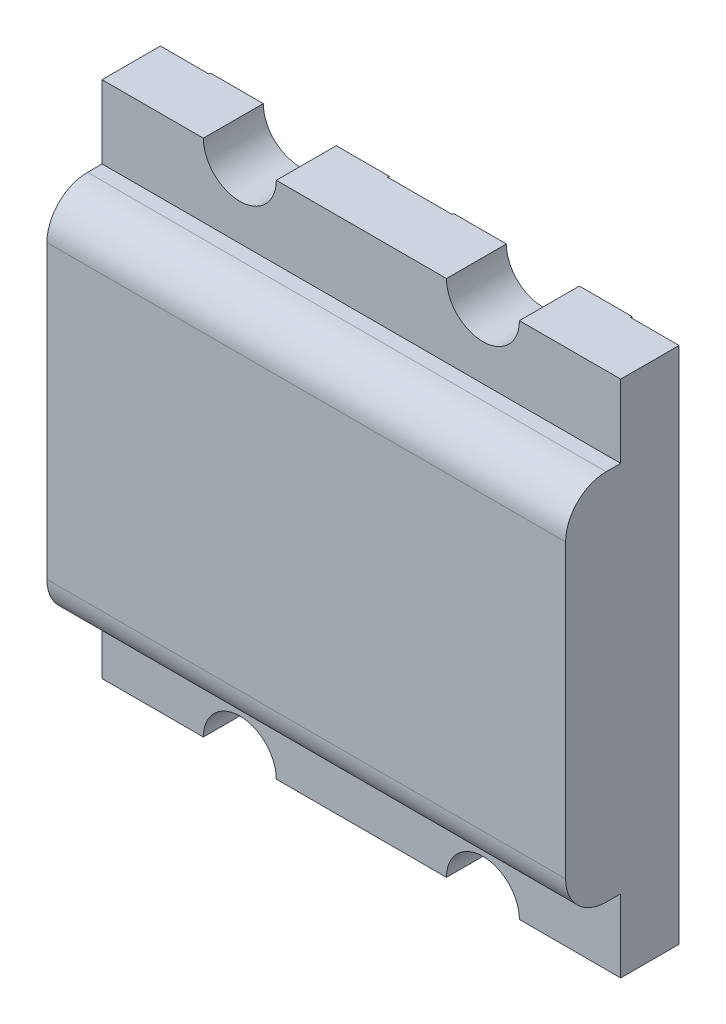
ISO-10303-21;
HEADER;
FILE_DESCRIPTION(('STEP AP214'),'2;1');
FILE_NAME('part.step','',(''),(''),'','','');
FILE_SCHEMA(('AUTOMOTIVE_DESIGN { 1 0 10303 214 1 1 1 1 }'));
ENDSEC;
DATA;
#1=APPLICATION_CONTEXT('core data for automotive mechanical design processes');
#2=APPLICATION_PROTOCOL_DEFINITION('international standard','automotive_design',2000,#1);
#3=PRODUCT_CONTEXT('',#1,'mechanical');
#4=PRODUCT('Part','Part','',(#3));
#5=PRODUCT_RELATED_PRODUCT_CATEGORY('part','',(#4));
#6=PRODUCT_DEFINITION_FORMATION('','',#4);
#7=PRODUCT_DEFINITION_CONTEXT('part definition',#1,'design');
#8=PRODUCT_DEFINITION('design','',#6,#7);
#9=PRODUCT_DEFINITION_SHAPE('','',#8);
#10=(LENGTH_UNIT() NAMED_UNIT(*) SI_UNIT(.MILLI.,.METRE.));
#11=(NAMED_UNIT(*) PLANE_ANGLE_UNIT() SI_UNIT($,.RADIAN.));
#12=(NAMED_UNIT(*) SI_UNIT($,.STERADIAN.) SOLID_ANGLE_UNIT());
#13=UNCERTAINTY_MEASURE_WITH_UNIT(LENGTH_MEASURE(1.E-05),#10,'distance_accuracy_value','');
#14=(GEOMETRIC_REPRESENTATION_CONTEXT(3) GLOBAL_UNCERTAINTY_ASSIGNED_CONTEXT((#13)) GLOBAL_UNIT_ASSIGNED_CONTEXT((#10,
#11,#12)) REPRESENTATION_CONTEXT('',''));
#15=CARTESIAN_POINT('',(0.,0.,0.));
#16=DIRECTION('',(0.,0.,1.));
#17=DIRECTION('',(1.,0.,0.));
#18=AXIS2_PLACEMENT_3D('',#15,#16,#17);
#19=CARTESIAN_POINT('',(-0.1,0.4,0.004895));
#20=DIRECTION('',(0.,-1.,0.));
#21=DIRECTION('',(-1.,0.,0.));
#22=AXIS2_PLACEMENT_3D('',#19,#20,#21);
#23=PLANE('',#22);
#24=DIRECTION('',(1.,0.,0.));
#25=VECTOR('',#24,1.);
#26=CARTESIAN_POINT('',(-0.05000000001,0.40000000001,0.00489500001));
#27=LINE('',#26,#25);
#28=CARTESIAN_POINT('',(-0.65,0.4,0.004895));
#29=VERTEX_POINT('',#28);
#30=CARTESIAN_POINT('',(-0.1,0.4,0.004895));
#31=VERTEX_POINT('',#30);
#32=EDGE_CURVE('E11',#29,#31,#27,.T.);
#33=ORIENTED_EDGE('',*,*,#32,.F.);
#34=DIRECTION('',(0.,0.,-1.));
#35=VECTOR('',#34,1.);
#36=CARTESIAN_POINT('',(-0.65000000001,0.40000000001,0.00489500001));
#37=LINE('',#36,#35);
#38=CARTESIAN_POINT('',(-0.65,0.4,0.));
#39=VERTEX_POINT('',#38);
#40=EDGE_CURVE('E25',#29,#39,#37,.T.);
#41=ORIENTED_EDGE('',*,*,#40,.T.);
#42=DIRECTION('',(-1.,0.,0.));
#43=VECTOR('',#42,1.);
#44=CARTESIAN_POINT('',(-0.10000000001,0.40000000001,0.));
#45=LINE('',#44,#43);
#46=CARTESIAN_POINT('',(-0.1,0.4,0.));
#47=VERTEX_POINT('',#46);
#48=EDGE_CURVE('E608',#47,#39,#45,.T.);
#49=ORIENTED_EDGE('',*,*,#48,.F.);
#50=DIRECTION('',(0.,0.,-1.));
#51=VECTOR('',#50,1.);
#52=CARTESIAN_POINT('',(-0.10000000001,0.40000000001,0.00489500001));
#53=LINE('',#52,#51);
#54=EDGE_CURVE('E604',#31,#47,#53,.T.);
#55=ORIENTED_EDGE('',*,*,#54,.F.);
#56=EDGE_LOOP('',(#33,#41,#49,#55));
#57=FACE_BOUND('',#56,.T.);
#58=ADVANCED_FACE('F17',(#57),#23,.T.);
#59=CARTESIAN_POINT('',(-0.1,0.8,0.004895));
#60=DIRECTION('',(1.,0.,0.));
#61=DIRECTION('',(0.,0.,1.));
#62=AXIS2_PLACEMENT_3D('',#59,#60,#61);
#63=PLANE('',#62);
#64=DIRECTION('',(0.,1.,0.));
#65=VECTOR('',#64,1.);
#66=CARTESIAN_POINT('',(-0.10000000001,0.40000000001,0.00489500001));
#67=LINE('',#66,#65);
#68=CARTESIAN_POINT('',(-0.1,0.8,0.004895));
#69=VERTEX_POINT('',#68);
#70=EDGE_CURVE('E601',#31,#69,#67,.T.);
#71=ORIENTED_EDGE('',*,*,#70,.F.);
#72=ORIENTED_EDGE('',*,*,#54,.T.);
#73=DIRECTION('',(0.,-1.,0.));
#74=VECTOR('',#73,1.);
#75=CARTESIAN_POINT('',(-0.10000000001,0.80000000001,0.));
#76=LINE('',#75,#74);
#77=CARTESIAN_POINT('',(-0.1,0.8,0.));
#78=VERTEX_POINT('',#77);
#79=EDGE_CURVE('E597',#78,#47,#76,.T.);
#80=ORIENTED_EDGE('',*,*,#79,.F.);
#81=DIRECTION('',(0.,0.,-1.));
#82=VECTOR('',#81,1.);
#83=CARTESIAN_POINT('',(-0.10000000001,0.80000000001,0.00489500001));
#84=LINE('',#83,#82);
#85=EDGE_CURVE('E593',#69,#78,#84,.T.);
#86=ORIENTED_EDGE('',*,*,#85,.F.);
#87=EDGE_LOOP('',(#71,#72,#80,#86));
#88=FACE_BOUND('',#87,.T.);
#89=ADVANCED_FACE('F635',(#88),#63,.T.);
#90=CARTESIAN_POINT('',(0.4,0.45,0.229895));
#91=DIRECTION('',(1.,0.,0.));
#92=DIRECTION('',(0.,0.707106781186548,0.707106781186548));
#93=AXIS2_PLACEMENT_3D('',#90,#91,#92);
#94=CYLINDRICAL_SURFACE('',#93,0.125);
#95=CARTESIAN_POINT('',(-0.80000000001,0.45000000001,0.22989500001));
#96=DIRECTION('',(1.,0.,0.));
#97=DIRECTION('',(0.,0.707106781186548,0.707106781186548));
#98=AXIS2_PLACEMENT_3D('',#95,#96,#97);
#99=CIRCLE('',#98,0.125);
#100=CARTESIAN_POINT('',(-0.8,0.575,0.229895));
#101=VERTEX_POINT('',#100);
#102=CARTESIAN_POINT('',(-0.8,0.45,0.354895));
#103=VERTEX_POINT('',#102);
#104=EDGE_CURVE('E590',#101,#103,#99,.T.);
#105=ORIENTED_EDGE('',*,*,#104,.T.);
#106=DIRECTION('',(1.,0.,0.));
#107=VECTOR('',#106,1.);
#108=CARTESIAN_POINT('',(0.40000000001,0.45000000001,0.35489500001));
#109=LINE('',#108,#107);
#110=CARTESIAN_POINT('',(0.8,0.45,0.354895));
#111=VERTEX_POINT('',#110);
#112=EDGE_CURVE('E587',#103,#111,#109,.T.);
#113=ORIENTED_EDGE('',*,*,#112,.T.);
#114=CARTESIAN_POINT('',(0.80000000001,0.45000000001,0.22989500001));
#115=DIRECTION('',(-1.,0.,0.));
#116=DIRECTION('',(0.,0.707106781186548,0.707106781186548));
#117=AXIS2_PLACEMENT_3D('',#114,#115,#116);
#118=CIRCLE('',#117,0.125);
#119=CARTESIAN_POINT('',(0.8,0.575,0.229895));
#120=VERTEX_POINT('',#119);
#121=EDGE_CURVE('E584',#111,#120,#118,.T.);
#122=ORIENTED_EDGE('',*,*,#121,.T.);
#123=DIRECTION('',(-1.,0.,0.));
#124=VECTOR('',#123,1.);
#125=CARTESIAN_POINT('',(0.40000000001,0.57500000001,0.22989500001));
#126=LINE('',#125,#124);
#127=EDGE_CURVE('E580',#120,#101,#126,.T.);
#128=ORIENTED_EDGE('',*,*,#127,.T.);
#129=EDGE_LOOP('',(#105,#113,#122,#128));
#130=FACE_BOUND('',#129,.T.);
#131=ADVANCED_FACE('F660',(#130),#94,.T.);
#132=CARTESIAN_POINT('',(0.,0.,0.354895));
#133=DIRECTION('',(0.,0.,1.));
#134=DIRECTION('',(1.,0.,0.));
#135=AXIS2_PLACEMENT_3D('',#132,#133,#134);
#136=PLANE('',#135);
#137=ORIENTED_EDGE('',*,*,#112,.F.);
#138=DIRECTION('',(0.,-1.,0.));
#139=VECTOR('',#138,1.);
#140=CARTESIAN_POINT('',(-0.80000000001,-0.57500000001,0.35489500001));
#141=LINE('',#140,#139);
#142=CARTESIAN_POINT('',(-0.8,-0.45,0.354895));
#143=VERTEX_POINT('',#142);
#144=EDGE_CURVE('E577',#103,#143,#141,.T.);
#145=ORIENTED_EDGE('',*,*,#144,.T.);
#146=DIRECTION('',(-1.,0.,0.));
#147=VECTOR('',#146,1.);
#148=CARTESIAN_POINT('',(-0.40000000001,-0.45000000001,0.35489500001));
#149=LINE('',#148,#147);
#150=CARTESIAN_POINT('',(0.8,-0.45,0.354895));
#151=VERTEX_POINT('',#150);
#152=EDGE_CURVE('E573',#151,#143,#149,.T.);
#153=ORIENTED_EDGE('',*,*,#152,.F.);
#154=DIRECTION('',(0.,1.,0.));
#155=VECTOR('',#154,1.);
#156=CARTESIAN_POINT('',(0.80000000001,0.57500000001,0.35489500001));
#157=LINE('',#156,#155);
#158=EDGE_CURVE('E569',#151,#111,#157,.T.);
#159=ORIENTED_EDGE('',*,*,#158,.T.);
#160=EDGE_LOOP('',(#137,#145,#153,#159));
#161=FACE_BOUND('',#160,.T.);
#162=ADVANCED_FACE('F664',(#161),#136,.T.);
#163=CARTESIAN_POINT('',(-0.8,0.8,0.004895));
#164=DIRECTION('',(-1.,0.,0.));
#165=DIRECTION('',(0.,1.,0.));
#166=AXIS2_PLACEMENT_3D('',#163,#164,#165);
#167=PLANE('',#166);
#168=ORIENTED_EDGE('',*,*,#104,.F.);
#169=DIRECTION('',(0.,0.,1.));
#170=VECTOR('',#169,1.);
#171=CARTESIAN_POINT('',(-0.80000000001,0.57500000001,0.18489500001));
#172=LINE('',#171,#170);
#173=CARTESIAN_POINT('',(-0.8,0.575,0.184895));
#174=VERTEX_POINT('',#173);
#175=EDGE_CURVE('E565',#174,#101,#172,.T.);
#176=ORIENTED_EDGE('',*,*,#175,.F.);
#177=DIRECTION('',(0.,-1.,0.));
#178=VECTOR('',#177,1.);
#179=CARTESIAN_POINT('',(-0.80000000001,-0.80000000001,0.18489500001));
#180=LINE('',#179,#178);
#181=CARTESIAN_POINT('',(-0.8,0.8,0.184895));
#182=VERTEX_POINT('',#181);
#183=EDGE_CURVE('E561',#182,#174,#180,.T.);
#184=ORIENTED_EDGE('',*,*,#183,.F.);
#185=DIRECTION('',(0.,0.,1.));
#186=VECTOR('',#185,1.);
#187=CARTESIAN_POINT('',(-0.80000000001,0.80000000001,0.00489500001));
#188=LINE('',#187,#186);
#189=CARTESIAN_POINT('',(-0.8,0.8,0.004895));
#190=VERTEX_POINT('',#189);
#191=EDGE_CURVE('E557',#190,#182,#188,.T.);
#192=ORIENTED_EDGE('',*,*,#191,.F.);
#193=DIRECTION('',(0.,1.,0.));
#194=VECTOR('',#193,1.);
#195=CARTESIAN_POINT('',(-0.80000000001,-0.80000000001,0.00489500001));
#196=LINE('',#195,#194);
#197=CARTESIAN_POINT('',(-0.8,-0.8,0.004895));
#198=VERTEX_POINT('',#197);
#199=EDGE_CURVE('E553',#198,#190,#196,.T.);
#200=ORIENTED_EDGE('',*,*,#199,.F.);
#201=DIRECTION('',(0.,0.,1.));
#202=VECTOR('',#201,1.);
#203=CARTESIAN_POINT('',(-0.80000000001,-0.80000000001,0.00489500001));
#204=LINE('',#203,#202);
#205=CARTESIAN_POINT('',(-0.8,-0.8,0.184895));
#206=VERTEX_POINT('',#205);
#207=EDGE_CURVE('E549',#198,#206,#204,.T.);
#208=ORIENTED_EDGE('',*,*,#207,.T.);
#209=DIRECTION('',(0.,-1.,0.));
#210=VECTOR('',#209,1.);
#211=CARTESIAN_POINT('',(-0.80000000001,-0.80000000001,0.18489500001));
#212=LINE('',#211,#210);
#213=CARTESIAN_POINT('',(-0.8,-0.575,0.184895));
#214=VERTEX_POINT('',#213);
#215=EDGE_CURVE('E545',#214,#206,#212,.T.);
#216=ORIENTED_EDGE('',*,*,#215,.F.);
#217=DIRECTION('',(0.,0.,1.));
#218=VECTOR('',#217,1.);
#219=CARTESIAN_POINT('',(-0.80000000001,-0.57500000001,0.18489500001));
#220=LINE('',#219,#218);
#221=CARTESIAN_POINT('',(-0.8,-0.575,0.229895));
#222=VERTEX_POINT('',#221);
#223=EDGE_CURVE('E542',#214,#222,#220,.T.);
#224=ORIENTED_EDGE('',*,*,#223,.T.);
#225=CARTESIAN_POINT('',(-0.80000000001,-0.45000000001,0.22989500001));
#226=DIRECTION('',(1.,0.,0.));
#227=DIRECTION('',(0.,-0.707106781186548,0.707106781186548));
#228=AXIS2_PLACEMENT_3D('',#225,#226,#227);
#229=CIRCLE('',#228,0.125);
#230=EDGE_CURVE('E538',#143,#222,#229,.T.);
#231=ORIENTED_EDGE('',*,*,#230,.F.);
#232=ORIENTED_EDGE('',*,*,#144,.F.);
#233=EDGE_LOOP('',(#168,#176,#184,#192,#200,#208,#216,#224,#231,#232));
#234=FACE_BOUND('',#233,.T.);
#235=ADVANCED_FACE('F671',(#234),#167,.T.);
#236=CARTESIAN_POINT('',(-0.4,-0.45,0.229895));
#237=DIRECTION('',(-1.,0.,0.));
#238=DIRECTION('',(0.,-0.707106781186548,0.707106781186548));
#239=AXIS2_PLACEMENT_3D('',#236,#237,#238);
#240=CYLINDRICAL_SURFACE('',#239,0.125);
#241=CARTESIAN_POINT('',(0.80000000001,-0.45000000001,0.22989500001));
#242=DIRECTION('',(-1.,0.,0.));
#243=DIRECTION('',(0.,-0.707106781186548,0.707106781186548));
#244=AXIS2_PLACEMENT_3D('',#241,#242,#243);
#245=CIRCLE('',#244,0.125);
#246=CARTESIAN_POINT('',(0.8,-0.575,0.229895));
#247=VERTEX_POINT('',#246);
#248=EDGE_CURVE('E534',#247,#151,#245,.T.);
#249=ORIENTED_EDGE('',*,*,#248,.T.);
#250=ORIENTED_EDGE('',*,*,#152,.T.);
#251=ORIENTED_EDGE('',*,*,#230,.T.);
#252=DIRECTION('',(1.,0.,0.));
#253=VECTOR('',#252,1.);
#254=CARTESIAN_POINT('',(-0.40000000001,-0.57500000001,0.22989500001));
#255=LINE('',#254,#253);
#256=EDGE_CURVE('E530',#222,#247,#255,.T.);
#257=ORIENTED_EDGE('',*,*,#256,.T.);
#258=EDGE_LOOP('',(#249,#250,#251,#257));
#259=FACE_BOUND('',#258,.T.);
#260=ADVANCED_FACE('F668',(#259),#240,.T.);
#261=CARTESIAN_POINT('',(-0.375,-0.8,0.));
#262=DIRECTION('',(0.,0.,-1.));
#263=DIRECTION('',(1.,0.,0.));
#264=AXIS2_PLACEMENT_3D('',#261,#262,#263);
#265=CYLINDRICAL_SURFACE('',#264,0.1125);
#266=DIRECTION('',(0.,0.,-1.));
#267=VECTOR('',#266,1.);
#268=CARTESIAN_POINT('',(-0.26250000001,-0.80000000001,0.));
#269=LINE('',#268,#267);
#270=CARTESIAN_POINT('',(-0.2625,-0.8,0.184895));
#271=VERTEX_POINT('',#270);
#272=CARTESIAN_POINT('',(-0.2625,-0.8,0.));
#273=VERTEX_POINT('',#272);
#274=EDGE_CURVE('E526',#271,#273,#269,.T.);
#275=ORIENTED_EDGE('',*,*,#274,.F.);
#276=CARTESIAN_POINT('',(-0.37500000001,-0.80000000001,0.18489500001));
#277=DIRECTION('',(0.,0.,-1.));
#278=DIRECTION('',(1.,0.,0.));
#279=AXIS2_PLACEMENT_3D('',#276,#277,#278);
#280=CIRCLE('',#279,0.1125);
#281=CARTESIAN_POINT('',(-0.4875,-0.8,0.184895));
#282=VERTEX_POINT('',#281);
#283=EDGE_CURVE('E523',#282,#271,#280,.T.);
#284=ORIENTED_EDGE('',*,*,#283,.F.);
#285=DIRECTION('',(0.,0.,1.));
#286=VECTOR('',#285,1.);
#287=CARTESIAN_POINT('',(-0.48750000001,-0.80000000001,0.));
#288=LINE('',#287,#286);
#289=CARTESIAN_POINT('',(-0.4875,-0.8,0.));
#290=VERTEX_POINT('',#289);
#291=EDGE_CURVE('E520',#290,#282,#288,.T.);
#292=ORIENTED_EDGE('',*,*,#291,.F.);
#293=CARTESIAN_POINT('',(-0.37500000001,-0.80000000001,0.));
#294=DIRECTION('',(0.,0.,1.));
#295=DIRECTION('',(1.,0.,0.));
#296=AXIS2_PLACEMENT_3D('',#293,#294,#295);
#297=CIRCLE('',#296,0.1125);
#298=EDGE_CURVE('E516',#273,#290,#297,.T.);
#299=ORIENTED_EDGE('',*,*,#298,.F.);
#300=EDGE_LOOP('',(#275,#284,#292,#299));
#301=FACE_BOUND('',#300,.T.);
#302=ADVANCED_FACE('F722',(#301),#265,.F.);
#303=CARTESIAN_POINT('',(-0.375,0.8,0.));
#304=DIRECTION('',(0.,0.,-1.));
#305=DIRECTION('',(1.,0.,0.));
#306=AXIS2_PLACEMENT_3D('',#303,#304,#305);
#307=CYLINDRICAL_SURFACE('',#306,0.1125);
#308=DIRECTION('',(0.,0.,1.));
#309=VECTOR('',#308,1.);
#310=CARTESIAN_POINT('',(-0.26250000001,0.80000000001,0.));
#311=LINE('',#310,#309);
#312=CARTESIAN_POINT('',(-0.2625,0.8,0.));
#313=VERTEX_POINT('',#312);
#314=CARTESIAN_POINT('',(-0.2625,0.8,0.184895));
#315=VERTEX_POINT('',#314);
#316=EDGE_CURVE('E513',#313,#315,#311,.T.);
#317=ORIENTED_EDGE('',*,*,#316,.F.);
#318=CARTESIAN_POINT('',(-0.37500000001,0.80000000001,0.));
#319=DIRECTION('',(0.,0.,1.));
#320=DIRECTION('',(1.,0.,0.));
#321=AXIS2_PLACEMENT_3D('',#318,#319,#320);
#322=CIRCLE('',#321,0.1125);
#323=CARTESIAN_POINT('',(-0.4875,0.8,0.));
#324=VERTEX_POINT('',#323);
#325=EDGE_CURVE('E509',#324,#313,#322,.T.);
#326=ORIENTED_EDGE('',*,*,#325,.F.);
#327=DIRECTION('',(0.,0.,-1.));
#328=VECTOR('',#327,1.);
#329=CARTESIAN_POINT('',(-0.48750000001,0.80000000001,0.));
#330=LINE('',#329,#328);
#331=CARTESIAN_POINT('',(-0.4875,0.8,0.184895));
#332=VERTEX_POINT('',#331);
#333=EDGE_CURVE('E506',#332,#324,#330,.T.);
#334=ORIENTED_EDGE('',*,*,#333,.F.);
#335=CARTESIAN_POINT('',(-0.37500000001,0.80000000001,0.18489500001));
#336=DIRECTION('',(0.,0.,-1.));
#337=DIRECTION('',(1.,0.,0.));
#338=AXIS2_PLACEMENT_3D('',#335,#336,#337);
#339=CIRCLE('',#338,0.1125);
#340=EDGE_CURVE('E503',#315,#332,#339,.T.);
#341=ORIENTED_EDGE('',*,*,#340,.F.);
#342=EDGE_LOOP('',(#317,#326,#334,#341));
#343=FACE_BOUND('',#342,.T.);
#344=ADVANCED_FACE('F720',(#343),#307,.F.);
#345=CARTESIAN_POINT('',(0.375,0.8,0.));
#346=DIRECTION('',(0.,0.,-1.));
#347=DIRECTION('',(1.,0.,0.));
#348=AXIS2_PLACEMENT_3D('',#345,#346,#347);
#349=CYLINDRICAL_SURFACE('',#348,0.1125);
#350=DIRECTION('',(0.,0.,1.));
#351=VECTOR('',#350,1.);
#352=CARTESIAN_POINT('',(0.48750000001,0.80000000001,0.));
#353=LINE('',#352,#351);
#354=CARTESIAN_POINT('',(0.4875,0.8,0.));
#355=VERTEX_POINT('',#354);
#356=CARTESIAN_POINT('',(0.4875,0.8,0.184895));
#357=VERTEX_POINT('',#356);
#358=EDGE_CURVE('E499',#355,#357,#353,.T.);
#359=ORIENTED_EDGE('',*,*,#358,.F.);
#360=CARTESIAN_POINT('',(0.37500000001,0.80000000001,0.));
#361=DIRECTION('',(0.,0.,1.));
#362=DIRECTION('',(1.,0.,0.));
#363=AXIS2_PLACEMENT_3D('',#360,#361,#362);
#364=CIRCLE('',#363,0.1125);
#365=CARTESIAN_POINT('',(0.2625,0.8,0.));
#366=VERTEX_POINT('',#365);
#367=EDGE_CURVE('E496',#366,#355,#364,.T.);
#368=ORIENTED_EDGE('',*,*,#367,.F.);
#369=DIRECTION('',(0.,0.,-1.));
#370=VECTOR('',#369,1.);
#371=CARTESIAN_POINT('',(0.26250000001,0.80000000001,0.));
#372=LINE('',#371,#370);
#373=CARTESIAN_POINT('',(0.2625,0.8,0.184895));
#374=VERTEX_POINT('',#373);
#375=EDGE_CURVE('E492',#374,#366,#372,.T.);
#376=ORIENTED_EDGE('',*,*,#375,.F.);
#377=CARTESIAN_POINT('',(0.37500000001,0.80000000001,0.18489500001));
#378=DIRECTION('',(0.,0.,-1.));
#379=DIRECTION('',(1.,0.,0.));
#380=AXIS2_PLACEMENT_3D('',#377,#378,#379);
#381=CIRCLE('',#380,0.1125);
#382=EDGE_CURVE('E489',#357,#374,#381,.T.);
#383=ORIENTED_EDGE('',*,*,#382,.F.);
#384=EDGE_LOOP('',(#359,#368,#376,#383));
#385=FACE_BOUND('',#384,.T.);
#386=ADVANCED_FACE('F643',(#385),#349,.F.);
#387=CARTESIAN_POINT('',(0.375,-0.8,0.));
#388=DIRECTION('',(0.,0.,-1.));
#389=DIRECTION('',(1.,0.,0.));
#390=AXIS2_PLACEMENT_3D('',#387,#388,#389);
#391=CYLINDRICAL_SURFACE('',#390,0.1125);
#392=DIRECTION('',(0.,0.,-1.));
#393=VECTOR('',#392,1.);
#394=CARTESIAN_POINT('',(0.48750000001,-0.80000000001,0.));
#395=LINE('',#394,#393);
#396=CARTESIAN_POINT('',(0.4875,-0.8,0.184895));
#397=VERTEX_POINT('',#396);
#398=CARTESIAN_POINT('',(0.4875,-0.8,0.));
#399=VERTEX_POINT('',#398);
#400=EDGE_CURVE('E486',#397,#399,#395,.T.);
#401=ORIENTED_EDGE('',*,*,#400,.F.);
#402=CARTESIAN_POINT('',(0.37500000001,-0.80000000001,0.18489500001));
#403=DIRECTION('',(0.,0.,-1.));
#404=DIRECTION('',(1.,0.,0.));
#405=AXIS2_PLACEMENT_3D('',#402,#403,#404);
#406=CIRCLE('',#405,0.1125);
#407=CARTESIAN_POINT('',(0.2625,-0.8,0.184895));
#408=VERTEX_POINT('',#407);
#409=EDGE_CURVE('E483',#408,#397,#406,.T.);
#410=ORIENTED_EDGE('',*,*,#409,.F.);
#411=DIRECTION('',(0.,0.,1.));
#412=VECTOR('',#411,1.);
#413=CARTESIAN_POINT('',(0.26250000001,-0.80000000001,0.));
#414=LINE('',#413,#412);
#415=CARTESIAN_POINT('',(0.2625,-0.8,0.));
#416=VERTEX_POINT('',#415);
#417=EDGE_CURVE('E479',#416,#408,#414,.T.);
#418=ORIENTED_EDGE('',*,*,#417,.F.);
#419=CARTESIAN_POINT('',(0.37500000001,-0.80000000001,0.));
#420=DIRECTION('',(0.,0.,1.));
#421=DIRECTION('',(1.,0.,0.));
#422=AXIS2_PLACEMENT_3D('',#419,#420,#421);
#423=CIRCLE('',#422,0.1125);
#424=EDGE_CURVE('E475',#399,#416,#423,.T.);
#425=ORIENTED_EDGE('',*,*,#424,.F.);
#426=EDGE_LOOP('',(#401,#410,#418,#425));
#427=FACE_BOUND('',#426,.T.);
#428=ADVANCED_FACE('F729',(#427),#391,.F.);
#429=CARTESIAN_POINT('',(-0.375,-0.6,0.));
#430=DIRECTION('',(0.,0.,-1.));
#431=DIRECTION('',(0.,-1.,0.));
#432=AXIS2_PLACEMENT_3D('',#429,#430,#431);
#433=PLANE('',#432);
#434=ORIENTED_EDGE('',*,*,#298,.T.);
#435=DIRECTION('',(-1.,0.,0.));
#436=VECTOR('',#435,1.);
#437=CARTESIAN_POINT('',(-0.10000000001,-0.80000000001,0.));
#438=LINE('',#437,#436);
#439=CARTESIAN_POINT('',(-0.65,-0.8,0.));
#440=VERTEX_POINT('',#439);
#441=EDGE_CURVE('E472',#290,#440,#438,.T.);
#442=ORIENTED_EDGE('',*,*,#441,.T.);
#443=DIRECTION('',(0.,1.,0.));
#444=VECTOR('',#443,1.);
#445=CARTESIAN_POINT('',(-0.65000000001,-0.80000000001,0.));
#446=LINE('',#445,#444);
#447=CARTESIAN_POINT('',(-0.65,-0.4,0.));
#448=VERTEX_POINT('',#447);
#449=EDGE_CURVE('E469',#440,#448,#446,.T.);
#450=ORIENTED_EDGE('',*,*,#449,.T.);
#451=DIRECTION('',(1.,0.,0.));
#452=VECTOR('',#451,1.);
#453=CARTESIAN_POINT('',(-0.65000000001,-0.40000000001,0.));
#454=LINE('',#453,#452);
#455=CARTESIAN_POINT('',(-0.1,-0.4,0.));
#456=VERTEX_POINT('',#455);
#457=EDGE_CURVE('E466',#448,#456,#454,.T.);
#458=ORIENTED_EDGE('',*,*,#457,.T.);
#459=DIRECTION('',(0.,-1.,0.));
#460=VECTOR('',#459,1.);
#461=CARTESIAN_POINT('',(-0.10000000001,-0.40000000001,0.));
#462=LINE('',#461,#460);
#463=CARTESIAN_POINT('',(-0.1,-0.8,0.));
#464=VERTEX_POINT('',#463);
#465=EDGE_CURVE('E462',#456,#464,#462,.T.);
#466=ORIENTED_EDGE('',*,*,#465,.T.);
#467=DIRECTION('',(-1.,0.,0.));
#468=VECTOR('',#467,1.);
#469=CARTESIAN_POINT('',(-0.10000000001,-0.80000000001,0.));
#470=LINE('',#469,#468);
#471=EDGE_CURVE('E459',#464,#273,#470,.T.);
#472=ORIENTED_EDGE('',*,*,#471,.T.);
#473=EDGE_LOOP('',(#434,#442,#450,#458,#466,#472));
#474=FACE_BOUND('',#473,.T.);
#475=ADVANCED_FACE('F781',(#474),#433,.T.);
#476=CARTESIAN_POINT('',(0.,0.,0.184895));
#477=DIRECTION('',(0.,0.,1.));
#478=DIRECTION('',(1.,0.,0.));
#479=AXIS2_PLACEMENT_3D('',#476,#477,#478);
#480=PLANE('',#479);
#481=ORIENTED_EDGE('',*,*,#340,.T.);
#482=DIRECTION('',(-1.,0.,0.));
#483=VECTOR('',#482,1.);
#484=CARTESIAN_POINT('',(-0.80000000001,0.80000000001,0.18489500001));
#485=LINE('',#484,#483);
#486=EDGE_CURVE('E456',#332,#182,#485,.T.);
#487=ORIENTED_EDGE('',*,*,#486,.T.);
#488=ORIENTED_EDGE('',*,*,#183,.T.);
#489=DIRECTION('',(1.,0.,0.));
#490=VECTOR('',#489,1.);
#491=CARTESIAN_POINT('',(0.40000000001,0.57500000001,0.18489500001));
#492=LINE('',#491,#490);
#493=CARTESIAN_POINT('',(0.8,0.575,0.184895));
#494=VERTEX_POINT('',#493);
#495=EDGE_CURVE('E453',#174,#494,#492,.T.);
#496=ORIENTED_EDGE('',*,*,#495,.T.);
#497=DIRECTION('',(0.,1.,0.));
#498=VECTOR('',#497,1.);
#499=CARTESIAN_POINT('',(0.80000000001,0.80000000001,0.18489500001));
#500=LINE('',#499,#498);
#501=CARTESIAN_POINT('',(0.8,0.8,0.184895));
#502=VERTEX_POINT('',#501);
#503=EDGE_CURVE('E449',#494,#502,#500,.T.);
#504=ORIENTED_EDGE('',*,*,#503,.T.);
#505=DIRECTION('',(-1.,0.,0.));
#506=VECTOR('',#505,1.);
#507=CARTESIAN_POINT('',(-0.80000000001,0.80000000001,0.18489500001));
#508=LINE('',#507,#506);
#509=EDGE_CURVE('E445',#502,#357,#508,.T.);
#510=ORIENTED_EDGE('',*,*,#509,.T.);
#511=ORIENTED_EDGE('',*,*,#382,.T.);
#512=DIRECTION('',(-1.,0.,0.));
#513=VECTOR('',#512,1.);
#514=CARTESIAN_POINT('',(-0.80000000001,0.80000000001,0.18489500001));
#515=LINE('',#514,#513);
#516=EDGE_CURVE('E441',#374,#315,#515,.T.);
#517=ORIENTED_EDGE('',*,*,#516,.T.);
#518=EDGE_LOOP('',(#481,#487,#488,#496,#504,#510,#511,#517));
#519=FACE_BOUND('',#518,.T.);
#520=ADVANCED_FACE('F648',(#519),#480,.T.);
#521=CARTESIAN_POINT('',(0.8,0.8,0.004895));
#522=DIRECTION('',(0.,1.,0.));
#523=DIRECTION('',(1.,0.,0.));
#524=AXIS2_PLACEMENT_3D('',#521,#522,#523);
#525=PLANE('',#524);
#526=ORIENTED_EDGE('',*,*,#333,.T.);
#527=DIRECTION('',(1.,0.,0.));
#528=VECTOR('',#527,1.);
#529=CARTESIAN_POINT('',(-0.65000000001,0.80000000001,0.));
#530=LINE('',#529,#528);
#531=CARTESIAN_POINT('',(-0.65,0.8,0.));
#532=VERTEX_POINT('',#531);
#533=EDGE_CURVE('E437',#532,#324,#530,.T.);
#534=ORIENTED_EDGE('',*,*,#533,.F.);
#535=DIRECTION('',(0.,0.,-1.));
#536=VECTOR('',#535,1.);
#537=CARTESIAN_POINT('',(-0.65000000001,0.80000000001,0.00489500001));
#538=LINE('',#537,#536);
#539=CARTESIAN_POINT('',(-0.65,0.8,0.004895));
#540=VERTEX_POINT('',#539);
#541=EDGE_CURVE('E434',#540,#532,#538,.T.);
#542=ORIENTED_EDGE('',*,*,#541,.F.);
#543=DIRECTION('',(1.,0.,0.));
#544=VECTOR('',#543,1.);
#545=CARTESIAN_POINT('',(-0.80000000001,0.80000000001,0.00489500001));
#546=LINE('',#545,#544);
#547=EDGE_CURVE('E430',#190,#540,#546,.T.);
#548=ORIENTED_EDGE('',*,*,#547,.F.);
#549=ORIENTED_EDGE('',*,*,#191,.T.);
#550=ORIENTED_EDGE('',*,*,#486,.F.);
#551=EDGE_LOOP('',(#526,#534,#542,#548,#549,#550));
#552=FACE_BOUND('',#551,.T.);
#553=ADVANCED_FACE('F621',(#552),#525,.T.);
#554=CARTESIAN_POINT('',(0.8,0.8,0.004895));
#555=DIRECTION('',(0.,1.,0.));
#556=DIRECTION('',(1.,0.,0.));
#557=AXIS2_PLACEMENT_3D('',#554,#555,#556);
#558=PLANE('',#557);
#559=ORIENTED_EDGE('',*,*,#358,.T.);
#560=ORIENTED_EDGE('',*,*,#509,.F.);
#561=DIRECTION('',(0.,0.,1.));
#562=VECTOR('',#561,1.);
#563=CARTESIAN_POINT('',(0.80000000001,0.80000000001,0.00489500001));
#564=LINE('',#563,#562);
#565=CARTESIAN_POINT('',(0.8,0.8,0.004895));
#566=VERTEX_POINT('',#565);
#567=EDGE_CURVE('E427',#566,#502,#564,.T.);
#568=ORIENTED_EDGE('',*,*,#567,.F.);
#569=DIRECTION('',(1.,0.,0.));
#570=VECTOR('',#569,1.);
#571=CARTESIAN_POINT('',(-0.80000000001,0.80000000001,0.00489500001));
#572=LINE('',#571,#570);
#573=CARTESIAN_POINT('',(0.65,0.8,0.004895));
#574=VERTEX_POINT('',#573);
#575=EDGE_CURVE('E423',#574,#566,#572,.T.);
#576=ORIENTED_EDGE('',*,*,#575,.F.);
#577=DIRECTION('',(0.,0.,-1.));
#578=VECTOR('',#577,1.);
#579=CARTESIAN_POINT('',(0.65000000001,0.80000000001,0.00489500001));
#580=LINE('',#579,#578);
#581=CARTESIAN_POINT('',(0.65,0.8,0.));
#582=VERTEX_POINT('',#581);
#583=EDGE_CURVE('E420',#574,#582,#580,.T.);
#584=ORIENTED_EDGE('',*,*,#583,.T.);
#585=DIRECTION('',(1.,0.,0.));
#586=VECTOR('',#585,1.);
#587=CARTESIAN_POINT('',(0.10000000001,0.80000000001,0.));
#588=LINE('',#587,#586);
#589=EDGE_CURVE('E242',#355,#582,#588,.T.);
#590=ORIENTED_EDGE('',*,*,#589,.F.);
#591=EDGE_LOOP('',(#559,#560,#568,#576,#584,#590));
#592=FACE_BOUND('',#591,.T.);
#593=ADVANCED_FACE('F646',(#592),#558,.T.);
#594=CARTESIAN_POINT('',(0.375,-0.6,0.));
#595=DIRECTION('',(0.,0.,-1.));
#596=DIRECTION('',(0.,-1.,0.));
#597=AXIS2_PLACEMENT_3D('',#594,#595,#596);
#598=PLANE('',#597);
#599=ORIENTED_EDGE('',*,*,#424,.T.);
#600=DIRECTION('',(-1.,0.,0.));
#601=VECTOR('',#600,1.);
#602=CARTESIAN_POINT('',(0.65000000001,-0.80000000001,0.));
#603=LINE('',#602,#601);
#604=CARTESIAN_POINT('',(0.1,-0.8,0.));
#605=VERTEX_POINT('',#604);
#606=EDGE_CURVE('E415',#416,#605,#603,.T.);
#607=ORIENTED_EDGE('',*,*,#606,.T.);
#608=DIRECTION('',(0.,1.,0.));
#609=VECTOR('',#608,1.);
#610=CARTESIAN_POINT('',(0.10000000001,-0.80000000001,0.));
#611=LINE('',#610,#609);
#612=CARTESIAN_POINT('',(0.1,-0.4,0.));
#613=VERTEX_POINT('',#612);
#614=EDGE_CURVE('E412',#605,#613,#611,.T.);
#615=ORIENTED_EDGE('',*,*,#614,.T.);
#616=DIRECTION('',(1.,0.,0.));
#617=VECTOR('',#616,1.);
#618=CARTESIAN_POINT('',(0.10000000001,-0.40000000001,0.));
#619=LINE('',#618,#617);
#620=CARTESIAN_POINT('',(0.65,-0.4,0.));
#621=VERTEX_POINT('',#620);
#622=EDGE_CURVE('E409',#613,#621,#619,.T.);
#623=ORIENTED_EDGE('',*,*,#622,.T.);
#624=DIRECTION('',(0.,-1.,0.));
#625=VECTOR('',#624,1.);
#626=CARTESIAN_POINT('',(0.65000000001,-0.40000000001,0.));
#627=LINE('',#626,#625);
#628=CARTESIAN_POINT('',(0.65,-0.8,0.));
#629=VERTEX_POINT('',#628);
#630=EDGE_CURVE('E406',#621,#629,#627,.T.);
#631=ORIENTED_EDGE('',*,*,#630,.T.);
#632=DIRECTION('',(-1.,0.,0.));
#633=VECTOR('',#632,1.);
#634=CARTESIAN_POINT('',(0.65000000001,-0.80000000001,0.));
#635=LINE('',#634,#633);
#636=EDGE_CURVE('E402',#629,#399,#635,.T.);
#637=ORIENTED_EDGE('',*,*,#636,.T.);
#638=EDGE_LOOP('',(#599,#607,#615,#623,#631,#637));
#639=FACE_BOUND('',#638,.T.);
#640=ADVANCED_FACE('F816',(#639),#598,.T.);
#641=CARTESIAN_POINT('',(-0.8,-0.8,0.004895));
#642=DIRECTION('',(0.,-1.,0.));
#643=DIRECTION('',(0.,0.,-1.));
#644=AXIS2_PLACEMENT_3D('',#641,#642,#643);
#645=PLANE('',#644);
#646=ORIENTED_EDGE('',*,*,#291,.T.);
#647=DIRECTION('',(1.,0.,0.));
#648=VECTOR('',#647,1.);
#649=CARTESIAN_POINT('',(0.80000000001,-0.80000000001,0.18489500001));
#650=LINE('',#649,#648);
#651=EDGE_CURVE('E398',#206,#282,#650,.T.);
#652=ORIENTED_EDGE('',*,*,#651,.F.);
#653=ORIENTED_EDGE('',*,*,#207,.F.);
#654=DIRECTION('',(-1.,0.,0.));
#655=VECTOR('',#654,1.);
#656=CARTESIAN_POINT('',(0.80000000001,-0.80000000001,0.00489500001));
#657=LINE('',#656,#655);
#658=CARTESIAN_POINT('',(-0.65,-0.8,0.004895));
#659=VERTEX_POINT('',#658);
#660=EDGE_CURVE('E395',#659,#198,#657,.T.);
#661=ORIENTED_EDGE('',*,*,#660,.F.);
#662=DIRECTION('',(0.,0.,-1.));
#663=VECTOR('',#662,1.);
#664=CARTESIAN_POINT('',(-0.65000000001,-0.80000000001,0.00489500001));
#665=LINE('',#664,#663);
#666=EDGE_CURVE('E391',#659,#440,#665,.T.);
#667=ORIENTED_EDGE('',*,*,#666,.T.);
#668=ORIENTED_EDGE('',*,*,#441,.F.);
#669=EDGE_LOOP('',(#646,#652,#653,#661,#667,#668));
#670=FACE_BOUND('',#669,.T.);
#671=ADVANCED_FACE('F717',(#670),#645,.T.);
#672=CARTESIAN_POINT('',(-0.8,-0.8,0.004895));
#673=DIRECTION('',(0.,-1.,0.));
#674=DIRECTION('',(0.,0.,-1.));
#675=AXIS2_PLACEMENT_3D('',#672,#673,#674);
#676=PLANE('',#675);
#677=ORIENTED_EDGE('',*,*,#400,.T.);
#678=ORIENTED_EDGE('',*,*,#636,.F.);
#679=DIRECTION('',(0.,0.,-1.));
#680=VECTOR('',#679,1.);
#681=CARTESIAN_POINT('',(0.65000000001,-0.80000000001,0.00489500001));
#682=LINE('',#681,#680);
#683=CARTESIAN_POINT('',(0.65,-0.8,0.004895));
#684=VERTEX_POINT('',#683);
#685=EDGE_CURVE('E387',#684,#629,#682,.T.);
#686=ORIENTED_EDGE('',*,*,#685,.F.);
#687=DIRECTION('',(-1.,0.,0.));
#688=VECTOR('',#687,1.);
#689=CARTESIAN_POINT('',(0.80000000001,-0.80000000001,0.00489500001));
#690=LINE('',#689,#688);
#691=CARTESIAN_POINT('',(0.8,-0.8,0.004895));
#692=VERTEX_POINT('',#691);
#693=EDGE_CURVE('E383',#692,#684,#690,.T.);
#694=ORIENTED_EDGE('',*,*,#693,.F.);
#695=DIRECTION('',(0.,0.,1.));
#696=VECTOR('',#695,1.);
#697=CARTESIAN_POINT('',(0.80000000001,-0.80000000001,0.00489500001));
#698=LINE('',#697,#696);
#699=CARTESIAN_POINT('',(0.8,-0.8,0.184895));
#700=VERTEX_POINT('',#699);
#701=EDGE_CURVE('E380',#692,#700,#698,.T.);
#702=ORIENTED_EDGE('',*,*,#701,.T.);
#703=DIRECTION('',(1.,0.,0.));
#704=VECTOR('',#703,1.);
#705=CARTESIAN_POINT('',(0.80000000001,-0.80000000001,0.18489500001));
#706=LINE('',#705,#704);
#707=EDGE_CURVE('E376',#397,#700,#706,.T.);
#708=ORIENTED_EDGE('',*,*,#707,.F.);
#709=EDGE_LOOP('',(#677,#678,#686,#694,#702,#708));
#710=FACE_BOUND('',#709,.T.);
#711=ADVANCED_FACE('F834',(#710),#676,.T.);
#712=CARTESIAN_POINT('',(-0.1,-0.4,0.004895));
#713=DIRECTION('',(1.,0.,0.));
#714=DIRECTION('',(0.,0.,1.));
#715=AXIS2_PLACEMENT_3D('',#712,#713,#714);
#716=PLANE('',#715);
#717=DIRECTION('',(0.,1.,0.));
#718=VECTOR('',#717,1.);
#719=CARTESIAN_POINT('',(-0.10000000001,-0.20000000001,0.00489500001));
#720=LINE('',#719,#718);
#721=CARTESIAN_POINT('',(-0.1,-0.8,0.004895));
#722=VERTEX_POINT('',#721);
#723=CARTESIAN_POINT('',(-0.1,-0.4,0.004895));
#724=VERTEX_POINT('',#723);
#725=EDGE_CURVE('E373',#722,#724,#720,.T.);
#726=ORIENTED_EDGE('',*,*,#725,.F.);
#727=DIRECTION('',(0.,0.,-1.));
#728=VECTOR('',#727,1.);
#729=CARTESIAN_POINT('',(-0.10000000001,-0.80000000001,0.00489500001));
#730=LINE('',#729,#728);
#731=EDGE_CURVE('E369',#722,#464,#730,.T.);
#732=ORIENTED_EDGE('',*,*,#731,.T.);
#733=ORIENTED_EDGE('',*,*,#465,.F.);
#734=DIRECTION('',(0.,0.,-1.));
#735=VECTOR('',#734,1.);
#736=CARTESIAN_POINT('',(-0.10000000001,-0.40000000001,0.00489500001));
#737=LINE('',#736,#735);
#738=EDGE_CURVE('E365',#724,#456,#737,.T.);
#739=ORIENTED_EDGE('',*,*,#738,.F.);
#740=EDGE_LOOP('',(#726,#732,#733,#739));
#741=FACE_BOUND('',#740,.T.);
#742=ADVANCED_FACE('F705',(#741),#716,.T.);
#743=CARTESIAN_POINT('',(-0.65,-0.4,0.004895));
#744=DIRECTION('',(0.,1.,0.));
#745=DIRECTION('',(1.,0.,0.));
#746=AXIS2_PLACEMENT_3D('',#743,#744,#745);
#747=PLANE('',#746);
#748=DIRECTION('',(-1.,0.,0.));
#749=VECTOR('',#748,1.);
#750=CARTESIAN_POINT('',(-0.32500000001,-0.40000000001,0.00489500001));
#751=LINE('',#750,#749);
#752=CARTESIAN_POINT('',(-0.65,-0.4,0.004895));
#753=VERTEX_POINT('',#752);
#754=EDGE_CURVE('E362',#724,#753,#751,.T.);
#755=ORIENTED_EDGE('',*,*,#754,.F.);
#756=ORIENTED_EDGE('',*,*,#738,.T.);
#757=ORIENTED_EDGE('',*,*,#457,.F.);
#758=DIRECTION('',(0.,0.,-1.));
#759=VECTOR('',#758,1.);
#760=CARTESIAN_POINT('',(-0.65000000001,-0.40000000001,0.00489500001));
#761=LINE('',#760,#759);
#762=EDGE_CURVE('E358',#753,#448,#761,.T.);
#763=ORIENTED_EDGE('',*,*,#762,.F.);
#764=EDGE_LOOP('',(#755,#756,#757,#763));
#765=FACE_BOUND('',#764,.T.);
#766=ADVANCED_FACE('F708',(#765),#747,.T.);
#767=CARTESIAN_POINT('',(-0.65,-0.8,0.004895));
#768=DIRECTION('',(-1.,0.,0.));
#769=DIRECTION('',(0.,0.,1.));
#770=AXIS2_PLACEMENT_3D('',#767,#768,#769);
#771=PLANE('',#770);
#772=DIRECTION('',(0.,-1.,0.));
#773=VECTOR('',#772,1.);
#774=CARTESIAN_POINT('',(-0.65000000001,-0.40000000001,0.00489500001));
#775=LINE('',#774,#773);
#776=EDGE_CURVE('E354',#753,#659,#775,.T.);
#777=ORIENTED_EDGE('',*,*,#776,.F.);
#778=ORIENTED_EDGE('',*,*,#762,.T.);
#779=ORIENTED_EDGE('',*,*,#449,.F.);
#780=ORIENTED_EDGE('',*,*,#666,.F.);
#781=EDGE_LOOP('',(#777,#778,#779,#780));
#782=FACE_BOUND('',#781,.T.);
#783=ADVANCED_FACE('F713',(#782),#771,.T.);
#784=CARTESIAN_POINT('',(-0.65,0.4,0.004895));
#785=DIRECTION('',(-1.,0.,0.));
#786=DIRECTION('',(0.,0.,1.));
#787=AXIS2_PLACEMENT_3D('',#784,#785,#786);
#788=PLANE('',#787);
#789=DIRECTION('',(0.,-1.,0.));
#790=VECTOR('',#789,1.);
#791=CARTESIAN_POINT('',(-0.65000000001,0.20000000001,0.00489500001));
#792=LINE('',#791,#790);
#793=EDGE_CURVE('E351',#540,#29,#792,.T.);
#794=ORIENTED_EDGE('',*,*,#793,.F.);
#795=ORIENTED_EDGE('',*,*,#541,.T.);
#796=DIRECTION('',(0.,1.,0.));
#797=VECTOR('',#796,1.);
#798=CARTESIAN_POINT('',(-0.65000000001,0.40000000001,0.));
#799=LINE('',#798,#797);
#800=EDGE_CURVE('E347',#39,#532,#799,.T.);
#801=ORIENTED_EDGE('',*,*,#800,.F.);
#802=ORIENTED_EDGE('',*,*,#40,.F.);
#803=EDGE_LOOP('',(#794,#795,#801,#802));
#804=FACE_BOUND('',#803,.T.);
#805=ADVANCED_FACE('F618',(#804),#788,.T.);
#806=CARTESIAN_POINT('',(0.,0.,0.184895));
#807=DIRECTION('',(0.,0.,1.));
#808=DIRECTION('',(1.,0.,0.));
#809=AXIS2_PLACEMENT_3D('',#806,#807,#808);
#810=PLANE('',#809);
#811=ORIENTED_EDGE('',*,*,#283,.T.);
#812=DIRECTION('',(1.,0.,0.));
#813=VECTOR('',#812,1.);
#814=CARTESIAN_POINT('',(0.80000000001,-0.80000000001,0.18489500001));
#815=LINE('',#814,#813);
#816=EDGE_CURVE('E343',#271,#408,#815,.T.);
#817=ORIENTED_EDGE('',*,*,#816,.T.);
#818=ORIENTED_EDGE('',*,*,#409,.T.);
#819=ORIENTED_EDGE('',*,*,#707,.T.);
#820=DIRECTION('',(0.,1.,0.));
#821=VECTOR('',#820,1.);
#822=CARTESIAN_POINT('',(0.80000000001,0.80000000001,0.18489500001));
#823=LINE('',#822,#821);
#824=CARTESIAN_POINT('',(0.8,-0.575,0.184895));
#825=VERTEX_POINT('',#824);
#826=EDGE_CURVE('E340',#700,#825,#823,.T.);
#827=ORIENTED_EDGE('',*,*,#826,.T.);
#828=DIRECTION('',(-1.,0.,0.));
#829=VECTOR('',#828,1.);
#830=CARTESIAN_POINT('',(-0.40000000001,-0.57500000001,0.18489500001));
#831=LINE('',#830,#829);
#832=EDGE_CURVE('E336',#825,#214,#831,.T.);
#833=ORIENTED_EDGE('',*,*,#832,.T.);
#834=ORIENTED_EDGE('',*,*,#215,.T.);
#835=ORIENTED_EDGE('',*,*,#651,.T.);
#836=EDGE_LOOP('',(#811,#817,#818,#819,#827,#833,#834,#835));
#837=FACE_BOUND('',#836,.T.);
#838=ADVANCED_FACE('F678',(#837),#810,.T.);
#839=CARTESIAN_POINT('',(0.8,0.8,0.004895));
#840=DIRECTION('',(0.,1.,0.));
#841=DIRECTION('',(1.,0.,0.));
#842=AXIS2_PLACEMENT_3D('',#839,#840,#841);
#843=PLANE('',#842);
#844=ORIENTED_EDGE('',*,*,#316,.T.);
#845=ORIENTED_EDGE('',*,*,#516,.F.);
#846=ORIENTED_EDGE('',*,*,#375,.T.);
#847=DIRECTION('',(1.,0.,0.));
#848=VECTOR('',#847,1.);
#849=CARTESIAN_POINT('',(0.10000000001,0.80000000001,0.));
#850=LINE('',#849,#848);
#851=CARTESIAN_POINT('',(0.1,0.8,0.));
#852=VERTEX_POINT('',#851);
#853=EDGE_CURVE('E332',#852,#366,#850,.T.);
#854=ORIENTED_EDGE('',*,*,#853,.F.);
#855=DIRECTION('',(0.,0.,-1.));
#856=VECTOR('',#855,1.);
#857=CARTESIAN_POINT('',(0.10000000001,0.80000000001,0.00489500001));
#858=LINE('',#857,#856);
#859=CARTESIAN_POINT('',(0.1,0.8,0.004895));
#860=VERTEX_POINT('',#859);
#861=EDGE_CURVE('E328',#860,#852,#858,.T.);
#862=ORIENTED_EDGE('',*,*,#861,.F.);
#863=DIRECTION('',(1.,0.,0.));
#864=VECTOR('',#863,1.);
#865=CARTESIAN_POINT('',(-0.80000000001,0.80000000001,0.00489500001));
#866=LINE('',#865,#864);
#867=EDGE_CURVE('E324',#69,#860,#866,.T.);
#868=ORIENTED_EDGE('',*,*,#867,.F.);
#869=ORIENTED_EDGE('',*,*,#85,.T.);
#870=DIRECTION('',(1.,0.,0.));
#871=VECTOR('',#870,1.);
#872=CARTESIAN_POINT('',(-0.65000000001,0.80000000001,0.));
#873=LINE('',#872,#871);
#874=EDGE_CURVE('E320',#313,#78,#873,.T.);
#875=ORIENTED_EDGE('',*,*,#874,.F.);
#876=EDGE_LOOP('',(#844,#845,#846,#854,#862,#868,#869,#875));
#877=FACE_BOUND('',#876,.T.);
#878=ADVANCED_FACE('F628',(#877),#843,.T.);
#879=CARTESIAN_POINT('',(0.8,-0.8,0.004895));
#880=DIRECTION('',(1.,0.,0.));
#881=DIRECTION('',(0.,1.,0.));
#882=AXIS2_PLACEMENT_3D('',#879,#880,#881);
#883=PLANE('',#882);
#884=ORIENTED_EDGE('',*,*,#121,.F.);
#885=ORIENTED_EDGE('',*,*,#158,.F.);
#886=ORIENTED_EDGE('',*,*,#248,.F.);
#887=DIRECTION('',(0.,0.,1.));
#888=VECTOR('',#887,1.);
#889=CARTESIAN_POINT('',(0.80000000001,-0.57500000001,0.18489500001));
#890=LINE('',#889,#888);
#891=EDGE_CURVE('E316',#825,#247,#890,.T.);
#892=ORIENTED_EDGE('',*,*,#891,.F.);
#893=ORIENTED_EDGE('',*,*,#826,.F.);
#894=ORIENTED_EDGE('',*,*,#701,.F.);
#895=DIRECTION('',(0.,-1.,0.));
#896=VECTOR('',#895,1.);
#897=CARTESIAN_POINT('',(0.80000000001,0.80000000001,0.00489500001));
#898=LINE('',#897,#896);
#899=EDGE_CURVE('E312',#566,#692,#898,.T.);
#900=ORIENTED_EDGE('',*,*,#899,.F.);
#901=ORIENTED_EDGE('',*,*,#567,.T.);
#902=ORIENTED_EDGE('',*,*,#503,.F.);
#903=DIRECTION('',(0.,0.,1.));
#904=VECTOR('',#903,1.);
#905=CARTESIAN_POINT('',(0.80000000001,0.57500000001,0.18489500001));
#906=LINE('',#905,#904);
#907=EDGE_CURVE('E308',#494,#120,#906,.T.);
#908=ORIENTED_EDGE('',*,*,#907,.T.);
#909=EDGE_LOOP('',(#884,#885,#886,#892,#893,#894,#900,#901,#902,#908));
#910=FACE_BOUND('',#909,.T.);
#911=ADVANCED_FACE('F653',(#910),#883,.T.);
#912=CARTESIAN_POINT('',(-0.8,-0.8,0.004895));
#913=DIRECTION('',(0.,-1.,0.));
#914=DIRECTION('',(0.,0.,-1.));
#915=AXIS2_PLACEMENT_3D('',#912,#913,#914);
#916=PLANE('',#915);
#917=ORIENTED_EDGE('',*,*,#274,.T.);
#918=ORIENTED_EDGE('',*,*,#471,.F.);
#919=ORIENTED_EDGE('',*,*,#731,.F.);
#920=DIRECTION('',(-1.,0.,0.));
#921=VECTOR('',#920,1.);
#922=CARTESIAN_POINT('',(0.80000000001,-0.80000000001,0.00489500001));
#923=LINE('',#922,#921);
#924=CARTESIAN_POINT('',(0.1,-0.8,0.004895));
#925=VERTEX_POINT('',#924);
#926=EDGE_CURVE('E304',#925,#722,#923,.T.);
#927=ORIENTED_EDGE('',*,*,#926,.F.);
#928=DIRECTION('',(0.,0.,-1.));
#929=VECTOR('',#928,1.);
#930=CARTESIAN_POINT('',(0.10000000001,-0.80000000001,0.00489500001));
#931=LINE('',#930,#929);
#932=EDGE_CURVE('E300',#925,#605,#931,.T.);
#933=ORIENTED_EDGE('',*,*,#932,.T.);
#934=ORIENTED_EDGE('',*,*,#606,.F.);
#935=ORIENTED_EDGE('',*,*,#417,.T.);
#936=ORIENTED_EDGE('',*,*,#816,.F.);
#937=EDGE_LOOP('',(#917,#918,#919,#927,#933,#934,#935,#936));
#938=FACE_BOUND('',#937,.T.);
#939=ADVANCED_FACE('F698',(#938),#916,.T.);
#940=CARTESIAN_POINT('',(0.,0.,0.004895));
#941=DIRECTION('',(0.,0.,1.));
#942=DIRECTION('',(1.,0.,0.));
#943=AXIS2_PLACEMENT_3D('',#940,#941,#942);
#944=PLANE('',#943);
#945=ORIENTED_EDGE('',*,*,#776,.T.);
#946=ORIENTED_EDGE('',*,*,#660,.T.);
#947=ORIENTED_EDGE('',*,*,#199,.T.);
#948=ORIENTED_EDGE('',*,*,#547,.T.);
#949=ORIENTED_EDGE('',*,*,#793,.T.);
#950=ORIENTED_EDGE('',*,*,#32,.T.);
#951=ORIENTED_EDGE('',*,*,#70,.T.);
#952=ORIENTED_EDGE('',*,*,#867,.T.);
#953=DIRECTION('',(0.,-1.,0.));
#954=VECTOR('',#953,1.);
#955=CARTESIAN_POINT('',(0.10000000001,0.20000000001,0.00489500001));
#956=LINE('',#955,#954);
#957=CARTESIAN_POINT('',(0.1,0.4,0.004895));
#958=VERTEX_POINT('',#957);
#959=EDGE_CURVE('E297',#860,#958,#956,.T.);
#960=ORIENTED_EDGE('',*,*,#959,.T.);
#961=DIRECTION('',(1.,0.,0.));
#962=VECTOR('',#961,1.);
#963=CARTESIAN_POINT('',(0.32500000001,0.40000000001,0.00489500001));
#964=LINE('',#963,#962);
#965=CARTESIAN_POINT('',(0.65,0.4,0.004895));
#966=VERTEX_POINT('',#965);
#967=EDGE_CURVE('E294',#958,#966,#964,.T.);
#968=ORIENTED_EDGE('',*,*,#967,.T.);
#969=DIRECTION('',(0.,1.,0.));
#970=VECTOR('',#969,1.);
#971=CARTESIAN_POINT('',(0.65000000001,0.40000000001,0.00489500001));
#972=LINE('',#971,#970);
#973=EDGE_CURVE('E252',#966,#574,#972,.T.);
#974=ORIENTED_EDGE('',*,*,#973,.T.);
#975=ORIENTED_EDGE('',*,*,#575,.T.);
#976=ORIENTED_EDGE('',*,*,#899,.T.);
#977=ORIENTED_EDGE('',*,*,#693,.T.);
#978=DIRECTION('',(0.,1.,0.));
#979=VECTOR('',#978,1.);
#980=CARTESIAN_POINT('',(0.65000000001,-0.20000000001,0.00489500001));
#981=LINE('',#980,#979);
#982=CARTESIAN_POINT('',(0.65,-0.4,0.004895));
#983=VERTEX_POINT('',#982);
#984=EDGE_CURVE('E289',#684,#983,#981,.T.);
#985=ORIENTED_EDGE('',*,*,#984,.T.);
#986=DIRECTION('',(-1.,0.,0.));
#987=VECTOR('',#986,1.);
#988=CARTESIAN_POINT('',(0.05000000001,-0.40000000001,0.00489500001));
#989=LINE('',#988,#987);
#990=CARTESIAN_POINT('',(0.1,-0.4,0.004895));
#991=VERTEX_POINT('',#990);
#992=EDGE_CURVE('E285',#983,#991,#989,.T.);
#993=ORIENTED_EDGE('',*,*,#992,.T.);
#994=DIRECTION('',(0.,-1.,0.));
#995=VECTOR('',#994,1.);
#996=CARTESIAN_POINT('',(0.10000000001,-0.40000000001,0.00489500001));
#997=LINE('',#996,#995);
#998=EDGE_CURVE('E281',#991,#925,#997,.T.);
#999=ORIENTED_EDGE('',*,*,#998,.T.);
#1000=ORIENTED_EDGE('',*,*,#926,.T.);
#1001=ORIENTED_EDGE('',*,*,#725,.T.);
#1002=ORIENTED_EDGE('',*,*,#754,.T.);
#1003=EDGE_LOOP('',(#945,#946,#947,#948,#949,#950,#951,#952,#960,#968,#974,#975,#976,#977,#985,
#993,#999,#1000,#1001,#1002));
#1004=FACE_BOUND('',#1003,.T.);
#1005=ADVANCED_FACE('F636',(#1004),#944,.F.);
#1006=CARTESIAN_POINT('',(0.1,0.4,0.004895));
#1007=DIRECTION('',(-1.,0.,0.));
#1008=DIRECTION('',(0.,0.,1.));
#1009=AXIS2_PLACEMENT_3D('',#1006,#1007,#1008);
#1010=PLANE('',#1009);
#1011=ORIENTED_EDGE('',*,*,#959,.F.);
#1012=ORIENTED_EDGE('',*,*,#861,.T.);
#1013=DIRECTION('',(0.,1.,0.));
#1014=VECTOR('',#1013,1.);
#1015=CARTESIAN_POINT('',(0.10000000001,0.40000000001,0.));
#1016=LINE('',#1015,#1014);
#1017=CARTESIAN_POINT('',(0.1,0.4,0.));
#1018=VERTEX_POINT('',#1017);
#1019=EDGE_CURVE('E278',#1018,#852,#1016,.T.);
#1020=ORIENTED_EDGE('',*,*,#1019,.F.);
#1021=DIRECTION('',(0.,0.,-1.));
#1022=VECTOR('',#1021,1.);
#1023=CARTESIAN_POINT('',(0.10000000001,0.40000000001,0.00489500001));
#1024=LINE('',#1023,#1022);
#1025=EDGE_CURVE('E261',#958,#1018,#1024,.T.);
#1026=ORIENTED_EDGE('',*,*,#1025,.F.);
#1027=EDGE_LOOP('',(#1011,#1012,#1020,#1026));
#1028=FACE_BOUND('',#1027,.T.);
#1029=ADVANCED_FACE('F639',(#1028),#1010,.T.);
#1030=CARTESIAN_POINT('',(0.1,-0.4,0.004895));
#1031=DIRECTION('',(0.,1.,0.));
#1032=DIRECTION('',(1.,0.,0.));
#1033=AXIS2_PLACEMENT_3D('',#1030,#1031,#1032);
#1034=PLANE('',#1033);
#1035=ORIENTED_EDGE('',*,*,#992,.F.);
#1036=DIRECTION('',(0.,0.,-1.));
#1037=VECTOR('',#1036,1.);
#1038=CARTESIAN_POINT('',(0.65000000001,-0.40000000001,0.00489500001));
#1039=LINE('',#1038,#1037);
#1040=EDGE_CURVE('E272',#983,#621,#1039,.T.);
#1041=ORIENTED_EDGE('',*,*,#1040,.T.);
#1042=ORIENTED_EDGE('',*,*,#622,.F.);
#1043=DIRECTION('',(0.,0.,-1.));
#1044=VECTOR('',#1043,1.);
#1045=CARTESIAN_POINT('',(0.10000000001,-0.40000000001,0.00489500001));
#1046=LINE('',#1045,#1044);
#1047=EDGE_CURVE('E256',#991,#613,#1046,.T.);
#1048=ORIENTED_EDGE('',*,*,#1047,.F.);
#1049=EDGE_LOOP('',(#1035,#1041,#1042,#1048));
#1050=FACE_BOUND('',#1049,.T.);
#1051=ADVANCED_FACE('F691',(#1050),#1034,.T.);
#1052=CARTESIAN_POINT('',(0.8,0.575,0.184895));
#1053=DIRECTION('',(0.,1.,0.));
#1054=DIRECTION('',(1.,0.,0.));
#1055=AXIS2_PLACEMENT_3D('',#1052,#1053,#1054);
#1056=PLANE('',#1055);
#1057=ORIENTED_EDGE('',*,*,#127,.F.);
#1058=ORIENTED_EDGE('',*,*,#907,.F.);
#1059=ORIENTED_EDGE('',*,*,#495,.F.);
#1060=ORIENTED_EDGE('',*,*,#175,.T.);
#1061=EDGE_LOOP('',(#1057,#1058,#1059,#1060));
#1062=FACE_BOUND('',#1061,.T.);
#1063=ADVANCED_FACE('F657',(#1062),#1056,.T.);
#1064=CARTESIAN_POINT('',(-0.8,-0.575,0.184895));
#1065=DIRECTION('',(0.,-1.,0.));
#1066=DIRECTION('',(0.,0.,-1.));
#1067=AXIS2_PLACEMENT_3D('',#1064,#1065,#1066);
#1068=PLANE('',#1067);
#1069=ORIENTED_EDGE('',*,*,#256,.F.);
#1070=ORIENTED_EDGE('',*,*,#223,.F.);
#1071=ORIENTED_EDGE('',*,*,#832,.F.);
#1072=ORIENTED_EDGE('',*,*,#891,.T.);
#1073=EDGE_LOOP('',(#1069,#1070,#1071,#1072));
#1074=FACE_BOUND('',#1073,.T.);
#1075=ADVANCED_FACE('F675',(#1074),#1068,.T.);
#1076=CARTESIAN_POINT('',(-0.375,0.6,0.));
#1077=DIRECTION('',(0.,0.,-1.));
#1078=DIRECTION('',(0.,-1.,0.));
#1079=AXIS2_PLACEMENT_3D('',#1076,#1077,#1078);
#1080=PLANE('',#1079);
#1081=ORIENTED_EDGE('',*,*,#325,.T.);
#1082=ORIENTED_EDGE('',*,*,#874,.T.);
#1083=ORIENTED_EDGE('',*,*,#79,.T.);
#1084=ORIENTED_EDGE('',*,*,#48,.T.);
#1085=ORIENTED_EDGE('',*,*,#800,.T.);
#1086=ORIENTED_EDGE('',*,*,#533,.T.);
#1087=EDGE_LOOP('',(#1081,#1082,#1083,#1084,#1085,#1086));
#1088=FACE_BOUND('',#1087,.T.);
#1089=ADVANCED_FACE('F617',(#1088),#1080,.T.);
#1090=CARTESIAN_POINT('',(0.65,0.8,0.004895));
#1091=DIRECTION('',(1.,0.,0.));
#1092=DIRECTION('',(0.,1.,0.));
#1093=AXIS2_PLACEMENT_3D('',#1090,#1091,#1092);
#1094=PLANE('',#1093);
#1095=ORIENTED_EDGE('',*,*,#973,.F.);
#1096=DIRECTION('',(0.,0.,-1.));
#1097=VECTOR('',#1096,1.);
#1098=CARTESIAN_POINT('',(0.65000000001,0.40000000001,0.00489500001));
#1099=LINE('',#1098,#1097);
#1100=CARTESIAN_POINT('',(0.65,0.4,0.));
#1101=VERTEX_POINT('',#1100);
#1102=EDGE_CURVE('E246',#966,#1101,#1099,.T.);
#1103=ORIENTED_EDGE('',*,*,#1102,.T.);
#1104=DIRECTION('',(0.,-1.,0.));
#1105=VECTOR('',#1104,1.);
#1106=CARTESIAN_POINT('',(0.65000000001,0.80000000001,0.));
#1107=LINE('',#1106,#1105);
#1108=EDGE_CURVE('E235',#582,#1101,#1107,.T.);
#1109=ORIENTED_EDGE('',*,*,#1108,.F.);
#1110=ORIENTED_EDGE('',*,*,#583,.F.);
#1111=EDGE_LOOP('',(#1095,#1103,#1109,#1110));
#1112=FACE_BOUND('',#1111,.T.);
#1113=ADVANCED_FACE('F250',(#1112),#1094,.T.);
#1114=CARTESIAN_POINT('',(0.1,-0.8,0.004895));
#1115=DIRECTION('',(-1.,0.,0.));
#1116=DIRECTION('',(0.,0.,1.));
#1117=AXIS2_PLACEMENT_3D('',#1114,#1115,#1116);
#1118=PLANE('',#1117);
#1119=ORIENTED_EDGE('',*,*,#998,.F.);
#1120=ORIENTED_EDGE('',*,*,#1047,.T.);
#1121=ORIENTED_EDGE('',*,*,#614,.F.);
#1122=ORIENTED_EDGE('',*,*,#932,.F.);
#1123=EDGE_LOOP('',(#1119,#1120,#1121,#1122));
#1124=FACE_BOUND('',#1123,.T.);
#1125=ADVANCED_FACE('F695',(#1124),#1118,.T.);
#1126=CARTESIAN_POINT('',(0.65,-0.4,0.004895));
#1127=DIRECTION('',(1.,0.,0.));
#1128=DIRECTION('',(0.,1.,0.));
#1129=AXIS2_PLACEMENT_3D('',#1126,#1127,#1128);
#1130=PLANE('',#1129);
#1131=ORIENTED_EDGE('',*,*,#984,.F.);
#1132=ORIENTED_EDGE('',*,*,#685,.T.);
#1133=ORIENTED_EDGE('',*,*,#630,.F.);
#1134=ORIENTED_EDGE('',*,*,#1040,.F.);
#1135=EDGE_LOOP('',(#1131,#1132,#1133,#1134));
#1136=FACE_BOUND('',#1135,.T.);
#1137=ADVANCED_FACE('F686',(#1136),#1130,.T.);
#1138=CARTESIAN_POINT('',(0.375,0.6,0.));
#1139=DIRECTION('',(0.,0.,-1.));
#1140=DIRECTION('',(0.,-1.,0.));
#1141=AXIS2_PLACEMENT_3D('',#1138,#1139,#1140);
#1142=PLANE('',#1141);
#1143=ORIENTED_EDGE('',*,*,#367,.T.);
#1144=ORIENTED_EDGE('',*,*,#589,.T.);
#1145=ORIENTED_EDGE('',*,*,#1108,.T.);
#1146=DIRECTION('',(-1.,0.,0.));
#1147=VECTOR('',#1146,1.);
#1148=CARTESIAN_POINT('',(0.65000000001,0.40000000001,0.));
#1149=LINE('',#1148,#1147);
#1150=EDGE_CURVE('E241',#1101,#1018,#1149,.T.);
#1151=ORIENTED_EDGE('',*,*,#1150,.T.);
#1152=ORIENTED_EDGE('',*,*,#1019,.T.);
#1153=ORIENTED_EDGE('',*,*,#853,.T.);
#1154=EDGE_LOOP('',(#1143,#1144,#1145,#1151,#1152,#1153));
#1155=FACE_BOUND('',#1154,.T.);
#1156=ADVANCED_FACE('F238',(#1155),#1142,.T.);
#1157=CARTESIAN_POINT('',(0.65,0.4,0.004895));
#1158=DIRECTION('',(0.,-1.,0.));
#1159=DIRECTION('',(0.,0.,-1.));
#1160=AXIS2_PLACEMENT_3D('',#1157,#1158,#1159);
#1161=PLANE('',#1160);
#1162=ORIENTED_EDGE('',*,*,#967,.F.);
#1163=ORIENTED_EDGE('',*,*,#1025,.T.);
#1164=ORIENTED_EDGE('',*,*,#1150,.F.);
#1165=ORIENTED_EDGE('',*,*,#1102,.F.);
#1166=EDGE_LOOP('',(#1162,#1163,#1164,#1165));
#1167=FACE_BOUND('',#1166,.T.);
#1168=ADVANCED_FACE('F259',(#1167),#1161,.T.);
#1169=CLOSED_SHELL('',(#58,#89,#131,#162,#235,#260,#302,#344,#386,#428,#475,#520,#553,#593,#640,
#671,#711,#742,#766,#783,#805,#838,#878,#911,#939,#1005,#1029,#1051,#1063,#1075,#1089,#1113,
#1125,#1137,#1156,#1168));
#1170=MANIFOLD_SOLID_BREP('B1',#1169);
#1171=ADVANCED_BREP_SHAPE_REPRESENTATION('',(#18,#1170),#14);
#1172=SHAPE_DEFINITION_REPRESENTATION(#9,#1171);
ENDSEC;
END-ISO-10303-21;
